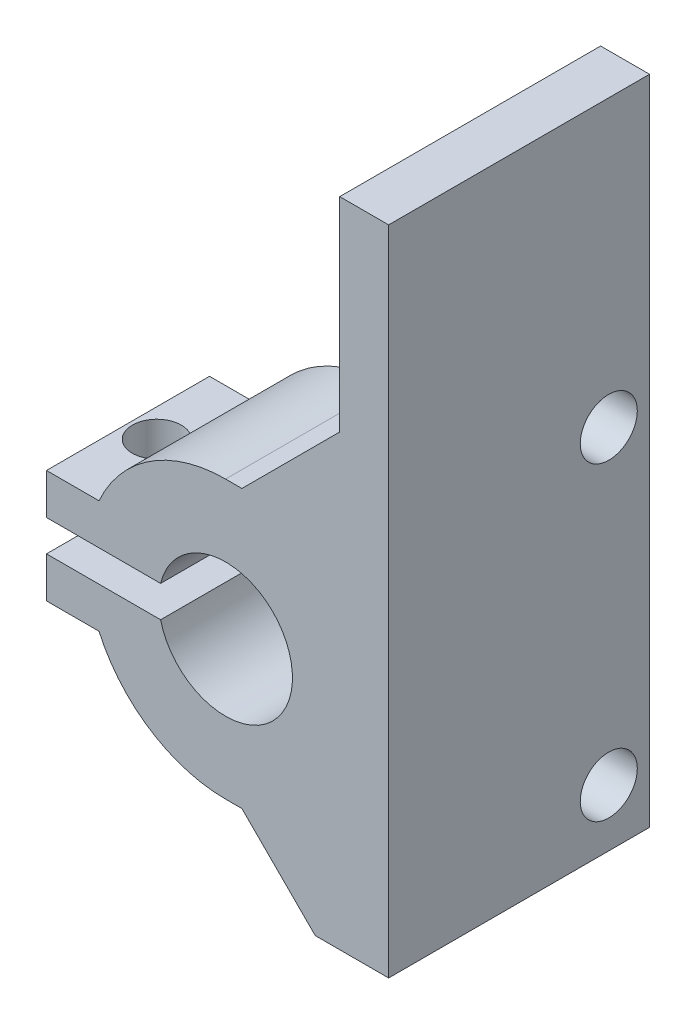
ISO-10303-21;
HEADER;
FILE_DESCRIPTION(('STEP AP214'),'2;1');
FILE_NAME('part.step','',(''),(''),'','','');
FILE_SCHEMA(('AUTOMOTIVE_DESIGN { 1 0 10303 214 1 1 1 1 }'));
ENDSEC;
DATA;
#1=APPLICATION_CONTEXT('core data for automotive mechanical design processes');
#2=APPLICATION_PROTOCOL_DEFINITION('international standard','automotive_design',2000,#1);
#3=PRODUCT_CONTEXT('',#1,'mechanical');
#4=PRODUCT('Part','Part','',(#3));
#5=PRODUCT_RELATED_PRODUCT_CATEGORY('part','',(#4));
#6=PRODUCT_DEFINITION_FORMATION('','',#4);
#7=PRODUCT_DEFINITION_CONTEXT('part definition',#1,'design');
#8=PRODUCT_DEFINITION('design','',#6,#7);
#9=PRODUCT_DEFINITION_SHAPE('','',#8);
#10=(LENGTH_UNIT() NAMED_UNIT(*) SI_UNIT(.MILLI.,.METRE.));
#11=(NAMED_UNIT(*) PLANE_ANGLE_UNIT() SI_UNIT($,.RADIAN.));
#12=(NAMED_UNIT(*) SI_UNIT($,.STERADIAN.) SOLID_ANGLE_UNIT());
#13=UNCERTAINTY_MEASURE_WITH_UNIT(LENGTH_MEASURE(1.E-05),#10,'distance_accuracy_value','');
#14=(GEOMETRIC_REPRESENTATION_CONTEXT(3) GLOBAL_UNCERTAINTY_ASSIGNED_CONTEXT((#13)) GLOBAL_UNIT_ASSIGNED_CONTEXT((#10,
#11,#12)) REPRESENTATION_CONTEXT('',''));
#15=CARTESIAN_POINT('',(0.,0.,0.));
#16=DIRECTION('',(0.,0.,1.));
#17=DIRECTION('',(1.,0.,0.));
#18=AXIS2_PLACEMENT_3D('',#15,#16,#17);
#19=CARTESIAN_POINT('',(0.,-8.5,10.));
#20=DIRECTION('',(0.,1.,0.));
#21=DIRECTION('',(0.,0.,1.));
#22=AXIS2_PLACEMENT_3D('',#19,#20,#21);
#23=PLANE('',#22);
#24=DIRECTION('',(1.,0.,0.));
#25=VECTOR('',#24,1.);
#26=CARTESIAN_POINT('',(0.,-8.5,0.));
#27=LINE('',#26,#25);
#28=CARTESIAN_POINT('',(0.,-8.5,0.));
#29=VERTEX_POINT('',#28);
#30=CARTESIAN_POINT('',(0.999999999999964,-8.5,0.));
#31=VERTEX_POINT('',#30);
#32=EDGE_CURVE('E448',#29,#31,#27,.T.);
#33=ORIENTED_EDGE('',*,*,#32,.T.);
#34=DIRECTION('',(0.,0.,1.));
#35=VECTOR('',#34,1.);
#36=CARTESIAN_POINT('',(0.999999999999964,-8.5,10.));
#37=LINE('',#36,#35);
#38=CARTESIAN_POINT('',(0.999999999999964,-8.5,10.));
#39=VERTEX_POINT('',#38);
#40=EDGE_CURVE('E439',#31,#39,#37,.T.);
#41=ORIENTED_EDGE('',*,*,#40,.T.);
#42=DIRECTION('',(1.,0.,0.));
#43=VECTOR('',#42,1.);
#44=CARTESIAN_POINT('',(0.,-8.5,10.));
#45=LINE('',#44,#43);
#46=CARTESIAN_POINT('',(0.,-8.5,10.));
#47=VERTEX_POINT('',#46);
#48=EDGE_CURVE('E735',#47,#39,#45,.T.);
#49=ORIENTED_EDGE('',*,*,#48,.F.);
#50=DIRECTION('',(0.,0.,-1.));
#51=VECTOR('',#50,1.);
#52=CARTESIAN_POINT('',(0.,-8.5,10.));
#53=LINE('',#52,#51);
#54=EDGE_CURVE('E454',#47,#29,#53,.T.);
#55=ORIENTED_EDGE('',*,*,#54,.T.);
#56=EDGE_LOOP('',(#33,#41,#49,#55));
#57=FACE_BOUND('',#56,.T.);
#58=ADVANCED_FACE('F34',(#57),#23,.F.);
#59=CARTESIAN_POINT('',(0.,8.5,10.));
#60=DIRECTION('',(0.,-1.,0.));
#61=DIRECTION('',(0.,0.,-1.));
#62=AXIS2_PLACEMENT_3D('',#59,#60,#61);
#63=PLANE('',#62);
#64=DIRECTION('',(-1.,0.,0.));
#65=VECTOR('',#64,1.);
#66=CARTESIAN_POINT('',(0.,8.5,10.));
#67=LINE('',#66,#65);
#68=CARTESIAN_POINT('',(0.999999999999912,8.5,10.));
#69=VERTEX_POINT('',#68);
#70=CARTESIAN_POINT('',(0.,8.5,10.));
#71=VERTEX_POINT('',#70);
#72=EDGE_CURVE('E733',#69,#71,#67,.T.);
#73=ORIENTED_EDGE('',*,*,#72,.F.);
#74=DIRECTION('',(0.,0.,-1.));
#75=VECTOR('',#74,1.);
#76=CARTESIAN_POINT('',(0.999999999999912,8.5,0.));
#77=LINE('',#76,#75);
#78=CARTESIAN_POINT('',(0.999999999999912,8.5,0.));
#79=VERTEX_POINT('',#78);
#80=EDGE_CURVE('E432',#69,#79,#77,.T.);
#81=ORIENTED_EDGE('',*,*,#80,.T.);
#82=DIRECTION('',(-1.,0.,0.));
#83=VECTOR('',#82,1.);
#84=CARTESIAN_POINT('',(0.,8.5,0.));
#85=LINE('',#84,#83);
#86=CARTESIAN_POINT('',(0.,8.5,0.));
#87=VERTEX_POINT('',#86);
#88=EDGE_CURVE('E455',#79,#87,#85,.T.);
#89=ORIENTED_EDGE('',*,*,#88,.T.);
#90=DIRECTION('',(0.,0.,-1.));
#91=VECTOR('',#90,1.);
#92=CARTESIAN_POINT('',(0.,8.5,10.));
#93=LINE('',#92,#91);
#94=EDGE_CURVE('E705',#71,#87,#93,.T.);
#95=ORIENTED_EDGE('',*,*,#94,.F.);
#96=EDGE_LOOP('',(#73,#81,#89,#95));
#97=FACE_BOUND('',#96,.T.);
#98=ADVANCED_FACE('F277',(#97),#63,.F.);
#99=CARTESIAN_POINT('',(0.,0.,0.));
#100=DIRECTION('',(0.,0.,1.));
#101=DIRECTION('',(1.,0.,0.));
#102=AXIS2_PLACEMENT_3D('',#99,#100,#101);
#103=PLANE('',#102);
#104=DIRECTION('',(0.,1.,0.));
#105=VECTOR('',#104,1.);
#106=CARTESIAN_POINT('',(6.,0.,0.));
#107=LINE('',#106,#105);
#108=CARTESIAN_POINT('',(6.,-12.,0.));
#109=VERTEX_POINT('',#108);
#110=CARTESIAN_POINT('',(6.,13.5,0.));
#111=VERTEX_POINT('',#110);
#112=EDGE_CURVE('E318',#109,#111,#107,.T.);
#113=ORIENTED_EDGE('',*,*,#112,.F.);
#114=DIRECTION('',(-0.707106781186548,0.707106781186548,0.));
#115=VECTOR('',#114,1.);
#116=CARTESIAN_POINT('',(-3.,-3.,0.));
#117=LINE('',#116,#115);
#118=CARTESIAN_POINT('',(7.00000000000001,-13.,0.));
#119=VERTEX_POINT('',#118);
#120=EDGE_CURVE('E11',#109,#119,#117,.F.);
#121=ORIENTED_EDGE('',*,*,#120,.T.);
#122=DIRECTION('',(1.,0.,0.));
#123=VECTOR('',#122,1.);
#124=CARTESIAN_POINT('',(10.,-13.,0.));
#125=LINE('',#124,#123);
#126=CARTESIAN_POINT('',(5.49999999999992,-13.,0.));
#127=VERTEX_POINT('',#126);
#128=EDGE_CURVE('E59',#119,#127,#125,.F.);
#129=ORIENTED_EDGE('',*,*,#128,.T.);
#130=DIRECTION('',(0.707106781186544,-0.707106781186551,0.));
#131=VECTOR('',#130,1.);
#132=CARTESIAN_POINT('',(-3.75000000000001,-3.74999999999997,0.));
#133=LINE('',#132,#131);
#134=EDGE_CURVE('E444',#127,#31,#133,.F.);
#135=ORIENTED_EDGE('',*,*,#134,.T.);
#136=ORIENTED_EDGE('',*,*,#32,.F.);
#137=CARTESIAN_POINT('',(0.,0.,0.));
#138=DIRECTION('',(0.,0.,1.));
#139=DIRECTION('',(1.,0.,0.));
#140=AXIS2_PLACEMENT_3D('',#137,#138,#139);
#141=CIRCLE('',#140,8.5);
#142=CARTESIAN_POINT('',(-7.76181764464928,-3.46470588235294,0.));
#143=VERTEX_POINT('',#142);
#144=EDGE_CURVE('E456',#143,#29,#141,.T.);
#145=ORIENTED_EDGE('',*,*,#144,.F.);
#146=DIRECTION('',(0.999999999999998,-6.08161782252128E-08,0.));
#147=VECTOR('',#146,1.);
#148=CARTESIAN_POINT('',(-7.76181764464928,-3.46470588235294,0.));
#149=LINE('',#148,#147);
#150=CARTESIAN_POINT('',(-10.984889325784,-3.46470568633804,0.));
#151=VERTEX_POINT('',#150);
#152=EDGE_CURVE('E672',#151,#143,#149,.T.);
#153=ORIENTED_EDGE('',*,*,#152,.F.);
#154=DIRECTION('',(0.,-1.,0.));
#155=VECTOR('',#154,1.);
#156=CARTESIAN_POINT('',(-10.984889325784,-0.964705686338039,0.));
#157=LINE('',#156,#155);
#158=CARTESIAN_POINT('',(-10.984889325784,-0.964705686338039,0.));
#159=VERTEX_POINT('',#158);
#160=EDGE_CURVE('E665',#159,#151,#157,.T.);
#161=ORIENTED_EDGE('',*,*,#160,.F.);
#162=DIRECTION('',(-1.,0.,0.));
#163=VECTOR('',#162,1.);
#164=CARTESIAN_POINT('',(-10.984889325784,-0.964705686338039,0.));
#165=LINE('',#164,#163);
#166=CARTESIAN_POINT('',(-3.98488932578397,-0.964705686338039,0.));
#167=VERTEX_POINT('',#166);
#168=EDGE_CURVE('E673',#167,#159,#165,.T.);
#169=ORIENTED_EDGE('',*,*,#168,.F.);
#170=CARTESIAN_POINT('',(0.,0.,0.));
#171=DIRECTION('',(0.,0.,-1.));
#172=DIRECTION('',(1.,0.,0.));
#173=AXIS2_PLACEMENT_3D('',#170,#171,#172);
#174=CIRCLE('',#173,4.1);
#175=CARTESIAN_POINT('',(-3.98488927833053,0.96470588235294,0.));
#176=VERTEX_POINT('',#175);
#177=EDGE_CURVE('E254',#176,#167,#174,.T.);
#178=ORIENTED_EDGE('',*,*,#177,.F.);
#179=DIRECTION('',(1.,0.,0.));
#180=VECTOR('',#179,1.);
#181=CARTESIAN_POINT('',(-3.98488927833053,0.96470588235294,0.));
#182=LINE('',#181,#180);
#183=CARTESIAN_POINT('',(-10.9848892783305,0.964705882352939,0.));
#184=VERTEX_POINT('',#183);
#185=EDGE_CURVE('E690',#184,#176,#182,.T.);
#186=ORIENTED_EDGE('',*,*,#185,.F.);
#187=DIRECTION('',(0.,-1.,0.));
#188=VECTOR('',#187,1.);
#189=CARTESIAN_POINT('',(-10.9848892783305,0.964705882352939,0.));
#190=LINE('',#189,#188);
#191=CARTESIAN_POINT('',(-10.9848892783305,3.46470588235294,0.));
#192=VERTEX_POINT('',#191);
#193=EDGE_CURVE('E688',#192,#184,#190,.T.);
#194=ORIENTED_EDGE('',*,*,#193,.F.);
#195=DIRECTION('',(-1.,0.,0.));
#196=VECTOR('',#195,1.);
#197=CARTESIAN_POINT('',(-10.9848892783305,3.46470588235294,0.));
#198=LINE('',#197,#196);
#199=CARTESIAN_POINT('',(-7.76181764464928,3.46470588235294,0.));
#200=VERTEX_POINT('',#199);
#201=EDGE_CURVE('E685',#200,#192,#198,.T.);
#202=ORIENTED_EDGE('',*,*,#201,.F.);
#203=CARTESIAN_POINT('',(0.,0.,0.));
#204=DIRECTION('',(0.,0.,1.));
#205=DIRECTION('',(1.,0.,0.));
#206=AXIS2_PLACEMENT_3D('',#203,#204,#205);
#207=CIRCLE('',#206,8.5);
#208=EDGE_CURVE('E682',#87,#200,#207,.T.);
#209=ORIENTED_EDGE('',*,*,#208,.F.);
#210=ORIENTED_EDGE('',*,*,#88,.F.);
#211=DIRECTION('',(-0.707106781186551,-0.707106781186544,0.));
#212=VECTOR('',#211,1.);
#213=CARTESIAN_POINT('',(-3.75000000000005,3.75000000000009,0.));
#214=LINE('',#213,#212);
#215=EDGE_CURVE('E437',#79,#111,#214,.F.);
#216=ORIENTED_EDGE('',*,*,#215,.T.);
#217=EDGE_LOOP('',(#113,#121,#129,#135,#136,#145,#153,#161,#169,#178,#186,#194,#202,#209,#210,#216));
#218=FACE_BOUND('',#217,.T.);
#219=ADVANCED_FACE('F273',(#218),#103,.F.);
#220=CARTESIAN_POINT('',(0.,0.,10.));
#221=DIRECTION('',(0.,0.,-1.));
#222=DIRECTION('',(-1.,0.,0.));
#223=AXIS2_PLACEMENT_3D('',#220,#221,#222);
#224=CYLINDRICAL_SURFACE('',#223,8.5);
#225=CARTESIAN_POINT('',(-7.76181764464928,-3.46470588235294,2.07242617561453));
#226=CARTESIAN_POINT('',(-7.70734472736729,-3.58681696636053,2.10081115035418));
#227=CARTESIAN_POINT('',(-7.65018241519739,-3.70705831735699,2.13247319057753));
#228=CARTESIAN_POINT('',(-7.53116662331992,-3.94321231160785,2.20379518649206));
#229=CARTESIAN_POINT('',(-7.46929984309949,-4.05911118617339,2.2434783869878));
#230=CARTESIAN_POINT('',(-7.34119272746333,-4.28650516625526,2.3326228547018));
#231=CARTESIAN_POINT('',(-7.27491177992635,-4.39793783217885,2.38218684616038));
#232=CARTESIAN_POINT('',(-7.14006586071867,-4.61363359849648,2.49218878601261));
#233=CARTESIAN_POINT('',(-7.071504046424,-4.71790604394668,2.5526121737255));
#234=CARTESIAN_POINT('',(-6.91665824478732,-4.94295333190967,2.70233681217529));
#235=CARTESIAN_POINT('',(-6.83021170452957,-5.06137364072598,2.79508238700871));
#236=CARTESIAN_POINT('',(-6.66154088136708,-5.28138288253585,3.00142428187995));
#237=CARTESIAN_POINT('',(-6.5793024296406,-5.38303126915351,3.11494380461664));
#238=CARTESIAN_POINT('',(-6.46310179875611,-5.52105462295688,3.30172903941076));
#239=CARTESIAN_POINT('',(-6.42533837513391,-5.56489214439046,3.36722508511447));
#240=CARTESIAN_POINT('',(-6.35328140252833,-5.64701565915378,3.50338331433131));
#241=CARTESIAN_POINT('',(-6.3189859775535,-5.68530465882771,3.57404266876227));
#242=CARTESIAN_POINT('',(-6.25471428850484,-5.75593922560085,3.72017104308801));
#243=CARTESIAN_POINT('',(-6.22473917375684,-5.78828321178442,3.79564133515645));
#244=CARTESIAN_POINT('',(-6.16994657451315,-5.84665405511785,3.95078124305059));
#245=CARTESIAN_POINT('',(-6.14512797744308,-5.87268227516636,4.03044994836312));
#246=CARTESIAN_POINT('',(-6.10466662305298,-5.9147073763916,4.18095462458582));
#247=CARTESIAN_POINT('',(-6.08820506011115,-5.93162441442413,4.2513155021302));
#248=CARTESIAN_POINT('',(-6.05988678166871,-5.9605521991224,4.39394220435443));
#249=CARTESIAN_POINT('',(-6.0480293784209,-5.97256367857076,4.46620774280172));
#250=CARTESIAN_POINT('',(-6.02919570336736,-5.99157583584486,4.61198443410922));
#251=CARTESIAN_POINT('',(-6.02221649345986,-5.99857952988329,4.68549480983648));
#252=CARTESIAN_POINT('',(-6.01328262996773,-6.00753394838576,4.833102108024));
#253=CARTESIAN_POINT('',(-6.01132758780307,-6.00948506362729,4.90719898467836));
#254=CARTESIAN_POINT('',(-6.01296842058666,-6.00785046198907,5.11255183870824));
#255=CARTESIAN_POINT('',(-6.0220105413055,-5.99883170337577,5.24380237215647));
#256=CARTESIAN_POINT('',(-6.05545546984858,-5.9650646002042,5.50213524949701));
#257=CARTESIAN_POINT('',(-6.07985460277206,-5.94032001878854,5.62921858293916));
#258=CARTESIAN_POINT('',(-6.14214679754113,-5.87588419173122,5.8754667151059));
#259=CARTESIAN_POINT('',(-6.17998571973372,-5.83625287813312,5.99466104042547));
#260=CARTESIAN_POINT('',(-6.26669625614904,-5.74304363856434,6.22312277742109));
#261=CARTESIAN_POINT('',(-6.31557054797636,-5.68946232730457,6.33238777082073));
#262=CARTESIAN_POINT('',(-6.42592563131725,-5.56461768120485,6.54808266326798));
#263=CARTESIAN_POINT('',(-6.4881213822584,-5.49224540546735,6.65349923047171));
#264=CARTESIAN_POINT('',(-6.61839299809601,-5.33453993555208,6.84995936307524));
#265=CARTESIAN_POINT('',(-6.68647091559546,-5.2492022090918,6.94099787960972));
#266=CARTESIAN_POINT('',(-6.80875890816746,-5.08905122024567,7.08909118167419));
#267=CARTESIAN_POINT('',(-6.86244542575364,-5.0165148102995,7.14909332997618));
#268=CARTESIAN_POINT('',(-6.97010771713046,-4.86581657176709,7.26134544417735));
#269=CARTESIAN_POINT('',(-7.02408361834585,-4.78765203744353,7.31359164392675));
#270=CARTESIAN_POINT('',(-7.13142000048256,-4.62625880711787,7.41100483790632));
#271=CARTESIAN_POINT('',(-7.18477829035631,-4.5430163197494,7.45615124257713));
#272=CARTESIAN_POINT('',(-7.28991379689209,-4.37232377386584,7.53986765244235));
#273=CARTESIAN_POINT('',(-7.34169055642498,-4.28487251730317,7.57843577072711));
#274=CARTESIAN_POINT('',(-7.45866614258649,-4.07876521041754,7.66069617217156));
#275=CARTESIAN_POINT('',(-7.52306974157909,-3.95881552079709,7.70229035785909));
#276=CARTESIAN_POINT('',(-7.61574359864451,-3.77559308356001,7.75810571622236));
#277=CARTESIAN_POINT('',(-7.64587509699423,-3.71420291559318,7.77556214195846));
#278=CARTESIAN_POINT('',(-7.70484076880066,-3.59028354188838,7.80854093952));
#279=CARTESIAN_POINT('',(-7.73367484414703,-3.52775425051117,7.8240631652389));
#280=CARTESIAN_POINT('',(-7.76181764464928,-3.46470588235294,7.83870747294992));
#281=B_SPLINE_CURVE_WITH_KNOTS('',3,(#225,#226,#227,#228,#229,#230,#231,#232,#233,#234,#235,
#236,#237,#238,#239,#240,#241,#242,#243,#244,#245,#246,#247,#248,#249,#250,#251,#252,#253,#254,
#255,#256,#257,#258,#259,#260,#261,#262,#263,#264,#265,#266,#267,#268,#269,#270,#271,#272,#273,
#274,#275,#276,#277,#278,#279,#280),.UNSPECIFIED.,.F.,.F.,(4,2,2,2,2,2,2,2,2,2,2,2,2,2,2,2,2,2,
2,2,2,2,2,2,2,2,2,4),(0.,0.410115252381126,0.821436485477286,1.23728073592192,1.65257151133061,
2.17125368228346,2.68805576014037,2.94990154283991,3.21160491540202,3.4733777805347,
3.73509410655712,3.95742378767881,4.17972024547532,4.4018827000276,4.62402797153626,
5.01755956905764,5.41099703107919,5.80286725178367,6.19483265762989,6.61980094949073,
7.0449181391339,7.36959836994546,7.69443574755307,8.02019844729648,8.34605443194326,
8.77258148688587,8.98428097866804,9.19599645222683),.UNSPECIFIED.);
#282=CARTESIAN_POINT('',(-7.76181764464928,-3.46470588235294,2.07242617561452));
#283=VERTEX_POINT('',#282);
#284=CARTESIAN_POINT('',(-7.76181764464928,-3.46470588235294,7.83870747294992));
#285=VERTEX_POINT('',#284);
#286=EDGE_CURVE('E311',#283,#285,#281,.T.);
#287=ORIENTED_EDGE('',*,*,#286,.F.);
#288=DIRECTION('',(0.,0.,-1.));
#289=VECTOR('',#288,1.);
#290=CARTESIAN_POINT('',(-7.76181764464928,-3.46470588235294,10.));
#291=LINE('',#290,#289);
#292=EDGE_CURVE('E709',#283,#143,#291,.T.);
#293=ORIENTED_EDGE('',*,*,#292,.T.);
#294=ORIENTED_EDGE('',*,*,#144,.T.);
#295=ORIENTED_EDGE('',*,*,#54,.F.);
#296=CARTESIAN_POINT('',(0.,0.,10.));
#297=DIRECTION('',(0.,0.,1.));
#298=DIRECTION('',(1.,0.,0.));
#299=AXIS2_PLACEMENT_3D('',#296,#297,#298);
#300=CIRCLE('',#299,8.5);
#301=CARTESIAN_POINT('',(-7.76181764464928,-3.46470588235294,10.));
#302=VERTEX_POINT('',#301);
#303=EDGE_CURVE('E737',#302,#47,#300,.T.);
#304=ORIENTED_EDGE('',*,*,#303,.F.);
#305=EDGE_CURVE('E710',#302,#285,#291,.T.);
#306=ORIENTED_EDGE('',*,*,#305,.T.);
#307=EDGE_LOOP('',(#287,#293,#294,#295,#304,#306));
#308=FACE_BOUND('',#307,.T.);
#309=ADVANCED_FACE('F276',(#308),#224,.T.);
#310=CARTESIAN_POINT('',(0.,0.,10.));
#311=DIRECTION('',(0.,0.,-1.));
#312=DIRECTION('',(-1.,0.,0.));
#313=AXIS2_PLACEMENT_3D('',#310,#311,#312);
#314=CYLINDRICAL_SURFACE('',#313,8.5);
#315=CARTESIAN_POINT('',(-7.76181764464928,3.46470588235294,7.83870747294992));
#316=CARTESIAN_POINT('',(-7.70734472716962,3.58681696678743,7.81032250196887));
#317=CARTESIAN_POINT('',(-7.65018241472601,3.70705831835817,7.77866046593117));
#318=CARTESIAN_POINT('',(-7.53116662200858,3.94321231414438,7.70733847934255));
#319=CARTESIAN_POINT('',(-7.4692998412233,4.05911118967474,7.66765528399389));
#320=CARTESIAN_POINT('',(-7.34119272393771,4.28650517234019,7.57851082763034));
#321=CARTESIAN_POINT('',(-7.2749117753096,4.39793783988758,7.52894684238349));
#322=CARTESIAN_POINT('',(-7.14006585314807,4.61363361028272,7.41894491592641));
#323=CARTESIAN_POINT('',(-7.07150403699106,4.71790605818371,7.35852153539273));
#324=CARTESIAN_POINT('',(-6.9166582269581,4.94295335716525,7.20879691110167));
#325=CARTESIAN_POINT('',(-6.83021167983953,5.06137367436531,7.11605134280611));
#326=CARTESIAN_POINT('',(-6.6615408411988,5.28138293350188,6.90970945998014));
#327=CARTESIAN_POINT('',(-6.57930238086281,5.38303132905389,6.79618994274583));
#328=CARTESIAN_POINT('',(-6.46310173599079,5.52105469650583,6.60940471453257));
#329=CARTESIAN_POINT('',(-6.42533830746112,5.56489222259375,6.5439086706838));
#330=CARTESIAN_POINT('',(-6.35328132486147,5.64701574659938,6.4077504444888));
#331=CARTESIAN_POINT('',(-6.31898589479999,5.68530475086158,6.33709109122536));
#332=CARTESIAN_POINT('',(-6.2547141955722,5.75593932664259,6.19096271847577));
#333=CARTESIAN_POINT('',(-6.22473907572978,5.78828331724839,6.11549242681791));
#334=CARTESIAN_POINT('',(-6.16994646647321,5.84665416917681,5.9603525189056));
#335=CARTESIAN_POINT('',(-6.14512786448435,5.87268239339849,5.88068381316477));
#336=CARTESIAN_POINT('',(-6.10466650177077,5.91470750159001,5.7301791369332));
#337=CARTESIAN_POINT('',(-6.0882049352753,5.93162454257068,5.65981825997892));
#338=CARTESIAN_POINT('',(-6.05988664991517,5.96055233308694,5.51719155844966));
#339=CARTESIAN_POINT('',(-6.04802924330305,5.97256381540539,5.4449260201074));
#340=CARTESIAN_POINT('',(-6.02919556180953,5.99157597830105,5.29914932855418));
#341=CARTESIAN_POINT('',(-6.02221634882589,5.99857967509132,5.22563895247654));
#342=CARTESIAN_POINT('',(-6.01328247955296,6.00753409894861,5.07803165318371));
#343=CARTESIAN_POINT('',(-6.01132743468341,6.00948521679333,5.0039347757745));
#344=CARTESIAN_POINT('',(-6.01296826053649,6.00785062217398,4.79858192404345));
#345=CARTESIAN_POINT('',(-6.02201037690383,5.99883186838657,4.66733139328176));
#346=CARTESIAN_POINT('',(-6.05545529724003,5.96506477540276,4.40899852027233));
#347=CARTESIAN_POINT('',(-6.07985442630622,5.94032019935066,4.28191518847454));
#348=CARTESIAN_POINT('',(-6.14214661365126,5.87588438390032,4.03566706037103));
#349=CARTESIAN_POINT('',(-6.17998553208615,5.83625307675208,3.91647273737142));
#350=CARTESIAN_POINT('',(-6.2666960615612,5.74304385081338,3.68801100390816));
#351=CARTESIAN_POINT('',(-6.31557035020664,5.68946254673333,3.57874601172113));
#352=CARTESIAN_POINT('',(-6.42592542752267,5.56461791641333,3.36305112112621));
#353=CARTESIAN_POINT('',(-6.48812117565637,5.49224564937529,3.25763455442991));
#354=CARTESIAN_POINT('',(-6.61839278688418,5.33454019743445,3.06117442177881));
#355=CARTESIAN_POINT('',(-6.68647070257968,5.24920248025364,2.97013590468416));
#356=CARTESIAN_POINT('',(-6.80875869274658,5.08905150834747,2.82204260111121));
#357=CARTESIAN_POINT('',(-6.86244520949138,5.01651510601874,2.76204045201187));
#358=CARTESIAN_POINT('',(-6.97010749985489,4.86581688288185,2.64978833574042));
#359=CARTESIAN_POINT('',(-7.02408340089867,4.78765235633666,2.59754213471757));
#360=CARTESIAN_POINT('',(-7.13141978345739,4.62625914153184,2.50012893773566));
#361=CARTESIAN_POINT('',(-7.18477807392549,4.54301666189837,2.45498253134633));
#362=CARTESIAN_POINT('',(-7.28991358232089,4.37232413147944,2.37126611778641));
#363=CARTESIAN_POINT('',(-7.34169034311902,4.28487288264578,2.33269799752634));
#364=CARTESIAN_POINT('',(-7.45866597081984,4.07876552678275,2.25043756467861));
#365=CARTESIAN_POINT('',(-7.52306960813854,3.95881577687387,2.20884335525103));
#366=CARTESIAN_POINT('',(-7.61574351857622,3.77559324571347,2.15302796805097));
#367=CARTESIAN_POINT('',(-7.64587503392524,3.71420304609196,2.13557153387555));
#368=CARTESIAN_POINT('',(-7.70484073833685,3.59028360795308,2.10259272133012));
#369=CARTESIAN_POINT('',(-7.73367482928953,3.52775428379688,2.08707048906595));
#370=CARTESIAN_POINT('',(-7.76181764464928,3.46470588235294,2.07242617561452));
#371=B_SPLINE_CURVE_WITH_KNOTS('',3,(#315,#316,#317,#318,#319,#320,#321,#322,#323,#324,#325,
#326,#327,#328,#329,#330,#331,#332,#333,#334,#335,#336,#337,#338,#339,#340,#341,#342,#343,#344,
#345,#346,#347,#348,#349,#350,#351,#352,#353,#354,#355,#356,#357,#358,#359,#360,#361,#362,#363,
#364,#365,#366,#367,#368,#369,#370),.UNSPECIFIED.,.F.,.F.,(4,2,2,2,2,2,2,2,2,2,2,2,2,2,2,2,2,2,
2,2,2,2,2,2,2,2,2,4),(0.,0.410115251401963,0.821436483303212,1.23728073266067,1.65257150709289,
2.17125369505933,2.68805579007703,2.94990158195271,3.21160496367354,3.47337783784949,
3.73509417289745,3.95742385670063,4.17972031716818,4.40188277437731,4.62402804853383,
5.01755963615662,5.41099708823609,5.8028672935807,6.19483268408238,6.61980095791385,
7.04491812938011,7.36959834499115,7.69443570737947,8.0201983923741,8.34605436231494,
8.77258164154295,8.98428124390928,9.19599682797043),.UNSPECIFIED.);
#372=CARTESIAN_POINT('',(-7.76181764464928,3.46470588235294,7.83870747294992));
#373=VERTEX_POINT('',#372);
#374=CARTESIAN_POINT('',(-7.76181764464928,3.46470588235294,2.07242617561452));
#375=VERTEX_POINT('',#374);
#376=EDGE_CURVE('E245',#373,#375,#371,.T.);
#377=ORIENTED_EDGE('',*,*,#376,.F.);
#378=DIRECTION('',(0.,0.,-1.));
#379=VECTOR('',#378,1.);
#380=CARTESIAN_POINT('',(-7.76181764464928,3.46470588235294,10.));
#381=LINE('',#380,#379);
#382=CARTESIAN_POINT('',(-7.76181764464928,3.46470588235294,10.));
#383=VERTEX_POINT('',#382);
#384=EDGE_CURVE('E702',#383,#373,#381,.T.);
#385=ORIENTED_EDGE('',*,*,#384,.F.);
#386=CARTESIAN_POINT('',(0.,0.,10.));
#387=DIRECTION('',(0.,0.,1.));
#388=DIRECTION('',(1.,0.,0.));
#389=AXIS2_PLACEMENT_3D('',#386,#387,#388);
#390=CIRCLE('',#389,8.5);
#391=EDGE_CURVE('E731',#71,#383,#390,.T.);
#392=ORIENTED_EDGE('',*,*,#391,.F.);
#393=ORIENTED_EDGE('',*,*,#94,.T.);
#394=ORIENTED_EDGE('',*,*,#208,.T.);
#395=EDGE_CURVE('E701',#375,#200,#381,.T.);
#396=ORIENTED_EDGE('',*,*,#395,.F.);
#397=EDGE_LOOP('',(#377,#385,#392,#393,#394,#396));
#398=FACE_BOUND('',#397,.T.);
#399=ADVANCED_FACE('F257',(#398),#314,.T.);
#400=CARTESIAN_POINT('',(0.,0.,10.));
#401=DIRECTION('',(0.,0.,-1.));
#402=DIRECTION('',(-1.,0.,0.));
#403=AXIS2_PLACEMENT_3D('',#400,#401,#402);
#404=CYLINDRICAL_SURFACE('',#403,4.1);
#405=ORIENTED_EDGE('',*,*,#177,.T.);
#406=DIRECTION('',(0.,0.,-1.));
#407=VECTOR('',#406,1.);
#408=CARTESIAN_POINT('',(-3.98488932578397,-0.964705686338039,10.));
#409=LINE('',#408,#407);
#410=CARTESIAN_POINT('',(-3.98488932578397,-0.964705686338039,10.));
#411=VERTEX_POINT('',#410);
#412=EDGE_CURVE('E319',#411,#167,#409,.T.);
#413=ORIENTED_EDGE('',*,*,#412,.F.);
#414=CARTESIAN_POINT('',(0.,0.,10.));
#415=DIRECTION('',(0.,0.,-1.));
#416=DIRECTION('',(1.,0.,0.));
#417=AXIS2_PLACEMENT_3D('',#414,#415,#416);
#418=CIRCLE('',#417,4.1);
#419=CARTESIAN_POINT('',(-3.98488927833053,0.96470588235294,10.));
#420=VERTEX_POINT('',#419);
#421=EDGE_CURVE('E255',#420,#411,#418,.T.);
#422=ORIENTED_EDGE('',*,*,#421,.F.);
#423=DIRECTION('',(0.,0.,-1.));
#424=VECTOR('',#423,1.);
#425=CARTESIAN_POINT('',(-3.98488927833053,0.96470588235294,10.));
#426=LINE('',#425,#424);
#427=EDGE_CURVE('E692',#420,#176,#426,.T.);
#428=ORIENTED_EDGE('',*,*,#427,.T.);
#429=EDGE_LOOP('',(#405,#413,#422,#428));
#430=FACE_BOUND('',#429,.T.);
#431=ADVANCED_FACE('F614',(#430),#404,.F.);
#432=CARTESIAN_POINT('',(-10.984889325784,-0.964705686338039,10.));
#433=DIRECTION('',(0.,-1.,0.));
#434=DIRECTION('',(0.,0.,-1.));
#435=AXIS2_PLACEMENT_3D('',#432,#433,#434);
#436=PLANE('',#435);
#437=CARTESIAN_POINT('',(-9.26181764464928,-0.964705686338039,4.95556682428222));
#438=DIRECTION('',(0.,-1.,0.));
#439=DIRECTION('',(0.,0.,-1.));
#440=AXIS2_PLACEMENT_3D('',#437,#438,#439);
#441=CIRCLE('',#440,1.5);
#442=CARTESIAN_POINT('',(-9.26181764464928,-0.964705686338039,3.45556682428222));
#443=VERTEX_POINT('',#442);
#444=EDGE_CURVE('E240',#443,#443,#441,.T.);
#445=ORIENTED_EDGE('',*,*,#444,.T.);
#446=EDGE_LOOP('',(#445));
#447=FACE_BOUND('',#446,.T.);
#448=ORIENTED_EDGE('',*,*,#168,.T.);
#449=DIRECTION('',(0.,0.,-1.));
#450=VECTOR('',#449,1.);
#451=CARTESIAN_POINT('',(-10.984889325784,-0.964705686338039,10.));
#452=LINE('',#451,#450);
#453=CARTESIAN_POINT('',(-10.984889325784,-0.964705686338039,10.));
#454=VERTEX_POINT('',#453);
#455=EDGE_CURVE('E671',#454,#159,#452,.T.);
#456=ORIENTED_EDGE('',*,*,#455,.F.);
#457=DIRECTION('',(-1.,0.,0.));
#458=VECTOR('',#457,1.);
#459=CARTESIAN_POINT('',(-10.984889325784,-0.964705686338039,10.));
#460=LINE('',#459,#458);
#461=EDGE_CURVE('E718',#411,#454,#460,.T.);
#462=ORIENTED_EDGE('',*,*,#461,.F.);
#463=ORIENTED_EDGE('',*,*,#412,.T.);
#464=EDGE_LOOP('',(#448,#456,#462,#463));
#465=FACE_BOUND('',#464,.T.);
#466=ADVANCED_FACE('F641',(#447,#465),#436,.F.);
#467=CARTESIAN_POINT('',(-10.984889325784,-0.964705686338039,10.));
#468=DIRECTION('',(1.,0.,0.));
#469=DIRECTION('',(0.,1.,0.));
#470=AXIS2_PLACEMENT_3D('',#467,#468,#469);
#471=PLANE('',#470);
#472=ORIENTED_EDGE('',*,*,#160,.T.);
#473=DIRECTION('',(0.,0.,-1.));
#474=VECTOR('',#473,1.);
#475=CARTESIAN_POINT('',(-10.984889325784,-3.46470568633804,10.));
#476=LINE('',#475,#474);
#477=CARTESIAN_POINT('',(-10.984889325784,-3.46470568633804,10.));
#478=VERTEX_POINT('',#477);
#479=EDGE_CURVE('E668',#478,#151,#476,.T.);
#480=ORIENTED_EDGE('',*,*,#479,.F.);
#481=DIRECTION('',(0.,-1.,0.));
#482=VECTOR('',#481,1.);
#483=CARTESIAN_POINT('',(-10.984889325784,-0.964705686338039,10.));
#484=LINE('',#483,#482);
#485=EDGE_CURVE('E741',#454,#478,#484,.T.);
#486=ORIENTED_EDGE('',*,*,#485,.F.);
#487=ORIENTED_EDGE('',*,*,#455,.T.);
#488=EDGE_LOOP('',(#472,#480,#486,#487));
#489=FACE_BOUND('',#488,.T.);
#490=ADVANCED_FACE('F292',(#489),#471,.F.);
#491=CARTESIAN_POINT('',(-7.76181764464928,-3.46470588235294,10.));
#492=DIRECTION('',(6.08161782252128E-08,0.999999999999998,0.));
#493=DIRECTION('',(-0.999999999999998,6.08161782252128E-08,0.));
#494=AXIS2_PLACEMENT_3D('',#491,#492,#493);
#495=PLANE('',#494);
#496=ORIENTED_EDGE('',*,*,#479,.T.);
#497=ORIENTED_EDGE('',*,*,#152,.T.);
#498=ORIENTED_EDGE('',*,*,#292,.F.);
#499=CARTESIAN_POINT('',(-9.26181764464928,-3.46470579112868,4.95556682428222));
#500=DIRECTION('',(-6.08161782252128E-08,-0.999999999999998,0.));
#501=DIRECTION('',(0.999999999999998,-6.08161782252128E-08,0.));
#502=AXIS2_PLACEMENT_3D('',#499,#500,#501);
#503=CIRCLE('',#502,3.25);
#504=EDGE_CURVE('E225',#283,#285,#503,.T.);
#505=ORIENTED_EDGE('',*,*,#504,.T.);
#506=ORIENTED_EDGE('',*,*,#305,.F.);
#507=DIRECTION('',(0.999999999999998,-6.08161782252128E-08,0.));
#508=VECTOR('',#507,1.);
#509=CARTESIAN_POINT('',(-7.76181764464928,-3.46470588235294,10.));
#510=LINE('',#509,#508);
#511=EDGE_CURVE('E739',#478,#302,#510,.T.);
#512=ORIENTED_EDGE('',*,*,#511,.F.);
#513=EDGE_LOOP('',(#496,#497,#498,#505,#506,#512));
#514=FACE_BOUND('',#513,.T.);
#515=CARTESIAN_POINT('',(-9.26181764464928,-3.46470579112867,4.95556682428222));
#516=DIRECTION('',(6.08161782252128E-08,0.999999999999998,0.));
#517=DIRECTION('',(-0.999999999999998,6.08161782252128E-08,0.));
#518=AXIS2_PLACEMENT_3D('',#515,#516,#517);
#519=CIRCLE('',#518,1.5);
#520=CARTESIAN_POINT('',(-10.7618176446493,-3.46470569990441,4.95556682428222));
#521=VERTEX_POINT('',#520);
#522=EDGE_CURVE('E237',#521,#521,#519,.T.);
#523=ORIENTED_EDGE('',*,*,#522,.T.);
#524=EDGE_LOOP('',(#523));
#525=FACE_BOUND('',#524,.T.);
#526=ADVANCED_FACE('F287',(#514,#525),#495,.F.);
#527=CARTESIAN_POINT('',(-10.9848892783305,3.46470588235294,10.));
#528=DIRECTION('',(0.,-1.,0.));
#529=DIRECTION('',(1.,0.,0.));
#530=AXIS2_PLACEMENT_3D('',#527,#528,#529);
#531=PLANE('',#530);
#532=CARTESIAN_POINT('',(-9.26181764464928,3.46470588235294,4.95556682428222));
#533=DIRECTION('',(0.,1.,0.));
#534=DIRECTION('',(-1.,0.,0.));
#535=AXIS2_PLACEMENT_3D('',#532,#533,#534);
#536=CIRCLE('',#535,1.5);
#537=CARTESIAN_POINT('',(-10.7618176446493,3.46470588235294,4.95556682428222));
#538=VERTEX_POINT('',#537);
#539=EDGE_CURVE('E228',#538,#538,#536,.T.);
#540=ORIENTED_EDGE('',*,*,#539,.F.);
#541=EDGE_LOOP('',(#540));
#542=FACE_BOUND('',#541,.T.);
#543=ORIENTED_EDGE('',*,*,#384,.T.);
#544=CARTESIAN_POINT('',(-9.26181764464928,3.46470588235294,4.95556682428222));
#545=DIRECTION('',(0.,1.,0.));
#546=DIRECTION('',(-1.,0.,0.));
#547=AXIS2_PLACEMENT_3D('',#544,#545,#546);
#548=CIRCLE('',#547,3.25);
#549=EDGE_CURVE('E243',#373,#375,#548,.T.);
#550=ORIENTED_EDGE('',*,*,#549,.T.);
#551=ORIENTED_EDGE('',*,*,#395,.T.);
#552=ORIENTED_EDGE('',*,*,#201,.T.);
#553=DIRECTION('',(0.,0.,-1.));
#554=VECTOR('',#553,1.);
#555=CARTESIAN_POINT('',(-10.9848892783305,3.46470588235294,10.));
#556=LINE('',#555,#554);
#557=CARTESIAN_POINT('',(-10.9848892783305,3.46470588235294,10.));
#558=VERTEX_POINT('',#557);
#559=EDGE_CURVE('E699',#558,#192,#556,.T.);
#560=ORIENTED_EDGE('',*,*,#559,.F.);
#561=DIRECTION('',(-1.,0.,0.));
#562=VECTOR('',#561,1.);
#563=CARTESIAN_POINT('',(-10.9848892783305,3.46470588235294,10.));
#564=LINE('',#563,#562);
#565=EDGE_CURVE('E729',#383,#558,#564,.T.);
#566=ORIENTED_EDGE('',*,*,#565,.F.);
#567=EDGE_LOOP('',(#543,#550,#551,#552,#560,#566));
#568=FACE_BOUND('',#567,.T.);
#569=ADVANCED_FACE('F284',(#542,#568),#531,.F.);
#570=CARTESIAN_POINT('',(-10.9848892783305,0.964705882352939,10.));
#571=DIRECTION('',(1.,0.,0.));
#572=DIRECTION('',(0.,1.,0.));
#573=AXIS2_PLACEMENT_3D('',#570,#571,#572);
#574=PLANE('',#573);
#575=ORIENTED_EDGE('',*,*,#193,.T.);
#576=DIRECTION('',(0.,0.,-1.));
#577=VECTOR('',#576,1.);
#578=CARTESIAN_POINT('',(-10.9848892783305,0.964705882352939,10.));
#579=LINE('',#578,#577);
#580=CARTESIAN_POINT('',(-10.9848892783305,0.964705882352939,10.));
#581=VERTEX_POINT('',#580);
#582=EDGE_CURVE('E695',#581,#184,#579,.T.);
#583=ORIENTED_EDGE('',*,*,#582,.F.);
#584=DIRECTION('',(0.,-1.,0.));
#585=VECTOR('',#584,1.);
#586=CARTESIAN_POINT('',(-10.9848892783305,0.964705882352939,10.));
#587=LINE('',#586,#585);
#588=EDGE_CURVE('E727',#558,#581,#587,.T.);
#589=ORIENTED_EDGE('',*,*,#588,.F.);
#590=ORIENTED_EDGE('',*,*,#559,.T.);
#591=EDGE_LOOP('',(#575,#583,#589,#590));
#592=FACE_BOUND('',#591,.T.);
#593=ADVANCED_FACE('F281',(#592),#574,.F.);
#594=CARTESIAN_POINT('',(-3.98488927833053,0.96470588235294,10.));
#595=DIRECTION('',(0.,1.,0.));
#596=DIRECTION('',(-1.,0.,0.));
#597=AXIS2_PLACEMENT_3D('',#594,#595,#596);
#598=PLANE('',#597);
#599=CARTESIAN_POINT('',(-9.26181764464928,0.96470588235294,4.95556682428222));
#600=DIRECTION('',(0.,1.,0.));
#601=DIRECTION('',(-1.,0.,0.));
#602=AXIS2_PLACEMENT_3D('',#599,#600,#601);
#603=CIRCLE('',#602,1.5);
#604=CARTESIAN_POINT('',(-10.7618176446493,0.964705882352939,4.95556682428222));
#605=VERTEX_POINT('',#604);
#606=EDGE_CURVE('E236',#605,#605,#603,.T.);
#607=ORIENTED_EDGE('',*,*,#606,.T.);
#608=EDGE_LOOP('',(#607));
#609=FACE_BOUND('',#608,.T.);
#610=ORIENTED_EDGE('',*,*,#185,.T.);
#611=ORIENTED_EDGE('',*,*,#427,.F.);
#612=DIRECTION('',(1.,0.,0.));
#613=VECTOR('',#612,1.);
#614=CARTESIAN_POINT('',(-3.98488927833053,0.96470588235294,10.));
#615=LINE('',#614,#613);
#616=EDGE_CURVE('E696',#581,#420,#615,.T.);
#617=ORIENTED_EDGE('',*,*,#616,.F.);
#618=ORIENTED_EDGE('',*,*,#582,.T.);
#619=EDGE_LOOP('',(#610,#611,#617,#618));
#620=FACE_BOUND('',#619,.T.);
#621=ADVANCED_FACE('F272',(#609,#620),#598,.F.);
#622=CARTESIAN_POINT('',(0.,0.,10.));
#623=DIRECTION('',(0.,0.,1.));
#624=DIRECTION('',(1.,0.,0.));
#625=AXIS2_PLACEMENT_3D('',#622,#623,#624);
#626=PLANE('',#625);
#627=DIRECTION('',(-1.,0.,0.));
#628=VECTOR('',#627,1.);
#629=CARTESIAN_POINT('',(10.,27.,10.));
#630=LINE('',#629,#628);
#631=CARTESIAN_POINT('',(10.,27.,10.));
#632=VERTEX_POINT('',#631);
#633=CARTESIAN_POINT('',(7.00000000000001,27.,10.));
#634=VERTEX_POINT('',#633);
#635=EDGE_CURVE('E406',#632,#634,#630,.T.);
#636=ORIENTED_EDGE('',*,*,#635,.T.);
#637=DIRECTION('',(0.,-1.,0.));
#638=VECTOR('',#637,1.);
#639=CARTESIAN_POINT('',(7.00000000000001,13.5,10.));
#640=LINE('',#639,#638);
#641=CARTESIAN_POINT('',(7.00000000000001,14.5,10.));
#642=VERTEX_POINT('',#641);
#643=EDGE_CURVE('E419',#634,#642,#640,.T.);
#644=ORIENTED_EDGE('',*,*,#643,.T.);
#645=DIRECTION('',(0.707106781186551,0.707106781186544,0.));
#646=VECTOR('',#645,1.);
#647=CARTESIAN_POINT('',(6.,13.5,10.));
#648=LINE('',#647,#646);
#649=EDGE_CURVE('E433',#642,#69,#648,.F.);
#650=ORIENTED_EDGE('',*,*,#649,.T.);
#651=ORIENTED_EDGE('',*,*,#72,.T.);
#652=ORIENTED_EDGE('',*,*,#391,.T.);
#653=ORIENTED_EDGE('',*,*,#565,.T.);
#654=ORIENTED_EDGE('',*,*,#588,.T.);
#655=ORIENTED_EDGE('',*,*,#616,.T.);
#656=ORIENTED_EDGE('',*,*,#421,.T.);
#657=ORIENTED_EDGE('',*,*,#461,.T.);
#658=ORIENTED_EDGE('',*,*,#485,.T.);
#659=ORIENTED_EDGE('',*,*,#511,.T.);
#660=ORIENTED_EDGE('',*,*,#303,.T.);
#661=ORIENTED_EDGE('',*,*,#48,.T.);
#662=DIRECTION('',(-0.707106781186544,0.707106781186551,0.));
#663=VECTOR('',#662,1.);
#664=CARTESIAN_POINT('',(6.,-13.5000000000001,10.));
#665=LINE('',#664,#663);
#666=CARTESIAN_POINT('',(5.49999999999992,-13.,10.));
#667=VERTEX_POINT('',#666);
#668=EDGE_CURVE('E223',#39,#667,#665,.F.);
#669=ORIENTED_EDGE('',*,*,#668,.T.);
#670=DIRECTION('',(-1.,0.,0.));
#671=VECTOR('',#670,1.);
#672=CARTESIAN_POINT('',(10.,-13.,10.));
#673=LINE('',#672,#671);
#674=CARTESIAN_POINT('',(10.,-13.,10.));
#675=VERTEX_POINT('',#674);
#676=EDGE_CURVE('E203',#675,#667,#673,.T.);
#677=ORIENTED_EDGE('',*,*,#676,.F.);
#678=DIRECTION('',(0.,-1.,0.));
#679=VECTOR('',#678,1.);
#680=CARTESIAN_POINT('',(10.,27.,10.));
#681=LINE('',#680,#679);
#682=EDGE_CURVE('E209',#632,#675,#681,.T.);
#683=ORIENTED_EDGE('',*,*,#682,.F.);
#684=EDGE_LOOP('',(#636,#644,#650,#651,#652,#653,#654,#655,#656,#657,#658,#659,#660,#661,#669,
#677,#683));
#685=FACE_BOUND('',#684,.T.);
#686=ADVANCED_FACE('F221',(#685),#626,.T.);
#687=CARTESIAN_POINT('',(-9.26181764464928,13.4647058823529,4.95556682428222));
#688=DIRECTION('',(0.,-1.,0.));
#689=DIRECTION('',(1.,0.,0.));
#690=AXIS2_PLACEMENT_3D('',#687,#688,#689);
#691=CYLINDRICAL_SURFACE('',#690,3.25);
#692=ORIENTED_EDGE('',*,*,#376,.T.);
#693=ORIENTED_EDGE('',*,*,#549,.F.);
#694=EDGE_LOOP('',(#692,#693));
#695=FACE_BOUND('',#694,.T.);
#696=ADVANCED_FACE('F261',(#695),#691,.F.);
#697=CARTESIAN_POINT('',(-9.26181764464928,-6.53529411764706,4.95556682428222));
#698=DIRECTION('',(0.,1.,0.));
#699=DIRECTION('',(-1.,0.,0.));
#700=AXIS2_PLACEMENT_3D('',#697,#698,#699);
#701=CYLINDRICAL_SURFACE('',#700,1.5);
#702=ORIENTED_EDGE('',*,*,#539,.T.);
#703=EDGE_LOOP('',(#702));
#704=FACE_BOUND('',#703,.T.);
#705=ORIENTED_EDGE('',*,*,#606,.F.);
#706=EDGE_LOOP('',(#705));
#707=FACE_BOUND('',#706,.T.);
#708=ADVANCED_FACE('F266',(#704,#707),#701,.F.);
#709=ORIENTED_EDGE('',*,*,#522,.F.);
#710=EDGE_LOOP('',(#709));
#711=FACE_BOUND('',#710,.T.);
#712=ORIENTED_EDGE('',*,*,#444,.F.);
#713=EDGE_LOOP('',(#712));
#714=FACE_BOUND('',#713,.T.);
#715=ADVANCED_FACE('F268',(#711,#714),#701,.F.);
#716=CARTESIAN_POINT('',(-9.26181825281107,-13.4647057911287,4.95556682428222));
#717=DIRECTION('',(6.08161782252128E-08,0.999999999999998,0.));
#718=DIRECTION('',(-0.999999999999998,6.08161782252128E-08,0.));
#719=AXIS2_PLACEMENT_3D('',#716,#717,#718);
#720=CYLINDRICAL_SURFACE('',#719,3.25);
#721=ORIENTED_EDGE('',*,*,#286,.T.);
#722=ORIENTED_EDGE('',*,*,#504,.F.);
#723=EDGE_LOOP('',(#721,#722));
#724=FACE_BOUND('',#723,.T.);
#725=ADVANCED_FACE('F322',(#724),#720,.F.);
#726=CARTESIAN_POINT('',(6.,0.,0.));
#727=DIRECTION('',(1.,0.,0.));
#728=DIRECTION('',(0.,0.,-1.));
#729=AXIS2_PLACEMENT_3D('',#726,#727,#728);
#730=PLANE('',#729);
#731=CARTESIAN_POINT('',(6.,9.5,-3.5));
#732=DIRECTION('',(1.,0.,0.));
#733=DIRECTION('',(0.,0.,-1.));
#734=AXIS2_PLACEMENT_3D('',#731,#732,#733);
#735=CIRCLE('',#734,1.75);
#736=CARTESIAN_POINT('',(6.,10.401387818866,-4.99999999999999));
#737=VERTEX_POINT('',#736);
#738=CARTESIAN_POINT('',(6.,8.59861218113398,-4.99999999999999));
#739=VERTEX_POINT('',#738);
#740=EDGE_CURVE('E774',#737,#739,#735,.T.);
#741=ORIENTED_EDGE('',*,*,#740,.T.);
#742=DIRECTION('',(0.,-1.,0.));
#743=VECTOR('',#742,1.);
#744=CARTESIAN_POINT('',(6.,0.,-4.99999999999999));
#745=LINE('',#744,#743);
#746=CARTESIAN_POINT('',(6.,-8.59861218113399,-4.99999999999999));
#747=VERTEX_POINT('',#746);
#748=EDGE_CURVE('E372',#739,#747,#745,.T.);
#749=ORIENTED_EDGE('',*,*,#748,.T.);
#750=CARTESIAN_POINT('',(6.,-9.5,-3.5));
#751=DIRECTION('',(1.,0.,0.));
#752=DIRECTION('',(0.,0.,-1.));
#753=AXIS2_PLACEMENT_3D('',#750,#751,#752);
#754=CIRCLE('',#753,1.75);
#755=CARTESIAN_POINT('',(6.,-10.401387818866,-4.99999999999999));
#756=VERTEX_POINT('',#755);
#757=EDGE_CURVE('E363',#747,#756,#754,.T.);
#758=ORIENTED_EDGE('',*,*,#757,.T.);
#759=DIRECTION('',(0.,-1.,0.));
#760=VECTOR('',#759,1.);
#761=CARTESIAN_POINT('',(6.,0.,-4.99999999999999));
#762=LINE('',#761,#760);
#763=CARTESIAN_POINT('',(6.,-12.,-4.99999999999999));
#764=VERTEX_POINT('',#763);
#765=EDGE_CURVE('E374',#756,#764,#762,.T.);
#766=ORIENTED_EDGE('',*,*,#765,.T.);
#767=DIRECTION('',(0.,0.,1.));
#768=VECTOR('',#767,1.);
#769=CARTESIAN_POINT('',(6.,-12.,0.));
#770=LINE('',#769,#768);
#771=EDGE_CURVE('E397',#764,#109,#770,.T.);
#772=ORIENTED_EDGE('',*,*,#771,.T.);
#773=ORIENTED_EDGE('',*,*,#112,.T.);
#774=DIRECTION('',(0.,0.,1.));
#775=VECTOR('',#774,1.);
#776=CARTESIAN_POINT('',(6.,13.5,10.));
#777=LINE('',#776,#775);
#778=CARTESIAN_POINT('',(6.,13.5,8.99999999999999));
#779=VERTEX_POINT('',#778);
#780=EDGE_CURVE('E429',#111,#779,#777,.T.);
#781=ORIENTED_EDGE('',*,*,#780,.T.);
#782=DIRECTION('',(0.,1.,0.));
#783=VECTOR('',#782,1.);
#784=CARTESIAN_POINT('',(6.,27.,8.99999999999999));
#785=LINE('',#784,#783);
#786=CARTESIAN_POINT('',(6.,26.,8.99999999999999));
#787=VERTEX_POINT('',#786);
#788=EDGE_CURVE('E401',#779,#787,#785,.T.);
#789=ORIENTED_EDGE('',*,*,#788,.T.);
#790=DIRECTION('',(0.,0.,-1.));
#791=VECTOR('',#790,1.);
#792=CARTESIAN_POINT('',(6.,26.,0.));
#793=LINE('',#792,#791);
#794=CARTESIAN_POINT('',(6.,26.,-4.99999999999999));
#795=VERTEX_POINT('',#794);
#796=EDGE_CURVE('E414',#787,#795,#793,.T.);
#797=ORIENTED_EDGE('',*,*,#796,.T.);
#798=DIRECTION('',(0.,-1.,0.));
#799=VECTOR('',#798,1.);
#800=CARTESIAN_POINT('',(6.,0.,-4.99999999999999));
#801=LINE('',#800,#799);
#802=EDGE_CURVE('E410',#795,#737,#801,.T.);
#803=ORIENTED_EDGE('',*,*,#802,.T.);
#804=EDGE_LOOP('',(#741,#749,#758,#766,#772,#773,#781,#789,#797,#803));
#805=FACE_BOUND('',#804,.T.);
#806=ADVANCED_FACE('F326',(#805),#730,.F.);
#807=CARTESIAN_POINT('',(10.,0.,0.));
#808=DIRECTION('',(1.,0.,0.));
#809=DIRECTION('',(0.,0.,-1.));
#810=AXIS2_PLACEMENT_3D('',#807,#808,#809);
#811=PLANE('',#810);
#812=CARTESIAN_POINT('',(10.,9.5,-3.5));
#813=DIRECTION('',(1.,0.,0.));
#814=DIRECTION('',(0.,0.,-1.));
#815=AXIS2_PLACEMENT_3D('',#812,#813,#814);
#816=CIRCLE('',#815,1.75);
#817=CARTESIAN_POINT('',(10.,9.5,-5.25000000000001));
#818=VERTEX_POINT('',#817);
#819=EDGE_CURVE('E219',#818,#818,#816,.T.);
#820=ORIENTED_EDGE('',*,*,#819,.F.);
#821=EDGE_LOOP('',(#820));
#822=FACE_BOUND('',#821,.T.);
#823=ORIENTED_EDGE('',*,*,#682,.T.);
#824=DIRECTION('',(0.,0.,-1.));
#825=VECTOR('',#824,1.);
#826=CARTESIAN_POINT('',(10.,-13.,10.));
#827=LINE('',#826,#825);
#828=CARTESIAN_POINT('',(10.,-13.,-6.));
#829=VERTEX_POINT('',#828);
#830=EDGE_CURVE('E199',#675,#829,#827,.T.);
#831=ORIENTED_EDGE('',*,*,#830,.T.);
#832=DIRECTION('',(0.,1.,0.));
#833=VECTOR('',#832,1.);
#834=CARTESIAN_POINT('',(10.,27.,-6.));
#835=LINE('',#834,#833);
#836=CARTESIAN_POINT('',(10.,27.,-6.));
#837=VERTEX_POINT('',#836);
#838=EDGE_CURVE('E208',#829,#837,#835,.T.);
#839=ORIENTED_EDGE('',*,*,#838,.T.);
#840=DIRECTION('',(0.,0.,1.));
#841=VECTOR('',#840,1.);
#842=CARTESIAN_POINT('',(10.,27.,10.));
#843=LINE('',#842,#841);
#844=EDGE_CURVE('E215',#837,#632,#843,.T.);
#845=ORIENTED_EDGE('',*,*,#844,.T.);
#846=EDGE_LOOP('',(#823,#831,#839,#845));
#847=FACE_BOUND('',#846,.T.);
#848=CARTESIAN_POINT('',(10.,-9.5,-3.5));
#849=DIRECTION('',(1.,0.,0.));
#850=DIRECTION('',(0.,0.,-1.));
#851=AXIS2_PLACEMENT_3D('',#848,#849,#850);
#852=CIRCLE('',#851,1.75);
#853=CARTESIAN_POINT('',(10.,-9.5,-5.25));
#854=VERTEX_POINT('',#853);
#855=EDGE_CURVE('E360',#854,#854,#852,.T.);
#856=ORIENTED_EDGE('',*,*,#855,.F.);
#857=EDGE_LOOP('',(#856));
#858=FACE_BOUND('',#857,.T.);
#859=ADVANCED_FACE('F212',(#822,#847,#858),#811,.T.);
#860=CARTESIAN_POINT('',(10.,-13.,10.));
#861=DIRECTION('',(0.,1.,0.));
#862=DIRECTION('',(0.,0.,1.));
#863=AXIS2_PLACEMENT_3D('',#860,#861,#862);
#864=PLANE('',#863);
#865=ORIENTED_EDGE('',*,*,#128,.F.);
#866=DIRECTION('',(0.,0.,-1.));
#867=VECTOR('',#866,1.);
#868=CARTESIAN_POINT('',(7.00000000000001,-13.,10.));
#869=LINE('',#868,#867);
#870=CARTESIAN_POINT('',(7.00000000000001,-13.,-6.));
#871=VERTEX_POINT('',#870);
#872=EDGE_CURVE('E396',#119,#871,#869,.T.);
#873=ORIENTED_EDGE('',*,*,#872,.T.);
#874=DIRECTION('',(-1.,0.,0.));
#875=VECTOR('',#874,1.);
#876=CARTESIAN_POINT('',(10.,-13.,-6.));
#877=LINE('',#876,#875);
#878=EDGE_CURVE('E205',#829,#871,#877,.T.);
#879=ORIENTED_EDGE('',*,*,#878,.F.);
#880=ORIENTED_EDGE('',*,*,#830,.F.);
#881=ORIENTED_EDGE('',*,*,#676,.T.);
#882=DIRECTION('',(0.,0.,1.));
#883=VECTOR('',#882,1.);
#884=CARTESIAN_POINT('',(5.49999999999992,-13.,10.));
#885=LINE('',#884,#883);
#886=EDGE_CURVE('E442',#667,#127,#885,.F.);
#887=ORIENTED_EDGE('',*,*,#886,.T.);
#888=EDGE_LOOP('',(#865,#873,#879,#880,#881,#887));
#889=FACE_BOUND('',#888,.T.);
#890=ADVANCED_FACE('F201',(#889),#864,.F.);
#891=CARTESIAN_POINT('',(10.,27.,-6.));
#892=DIRECTION('',(0.,0.,1.));
#893=DIRECTION('',(0.,-1.,0.));
#894=AXIS2_PLACEMENT_3D('',#891,#892,#893);
#895=PLANE('',#894);
#896=ORIENTED_EDGE('',*,*,#878,.T.);
#897=DIRECTION('',(0.,1.,0.));
#898=VECTOR('',#897,1.);
#899=CARTESIAN_POINT('',(7.00000000000001,27.,-6.));
#900=LINE('',#899,#898);
#901=CARTESIAN_POINT('',(7.00000000000001,27.,-6.));
#902=VERTEX_POINT('',#901);
#903=EDGE_CURVE('E51',#871,#902,#900,.T.);
#904=ORIENTED_EDGE('',*,*,#903,.T.);
#905=DIRECTION('',(-1.,0.,0.));
#906=VECTOR('',#905,1.);
#907=CARTESIAN_POINT('',(10.,27.,-6.));
#908=LINE('',#907,#906);
#909=EDGE_CURVE('E230',#837,#902,#908,.T.);
#910=ORIENTED_EDGE('',*,*,#909,.F.);
#911=ORIENTED_EDGE('',*,*,#838,.F.);
#912=EDGE_LOOP('',(#896,#904,#910,#911));
#913=FACE_BOUND('',#912,.T.);
#914=ADVANCED_FACE('F330',(#913),#895,.F.);
#915=CARTESIAN_POINT('',(10.,27.,10.));
#916=DIRECTION('',(0.,-1.,0.));
#917=DIRECTION('',(0.,0.,-1.));
#918=AXIS2_PLACEMENT_3D('',#915,#916,#917);
#919=PLANE('',#918);
#920=ORIENTED_EDGE('',*,*,#909,.T.);
#921=DIRECTION('',(0.,0.,1.));
#922=VECTOR('',#921,1.);
#923=CARTESIAN_POINT('',(7.00000000000001,27.,10.));
#924=LINE('',#923,#922);
#925=EDGE_CURVE('E375',#902,#634,#924,.T.);
#926=ORIENTED_EDGE('',*,*,#925,.T.);
#927=ORIENTED_EDGE('',*,*,#635,.F.);
#928=ORIENTED_EDGE('',*,*,#844,.F.);
#929=EDGE_LOOP('',(#920,#926,#927,#928));
#930=FACE_BOUND('',#929,.T.);
#931=ADVANCED_FACE('F333',(#930),#919,.F.);
#932=CARTESIAN_POINT('',(10.,9.5,-3.5));
#933=DIRECTION('',(-1.,0.,0.));
#934=DIRECTION('',(0.,0.,1.));
#935=AXIS2_PLACEMENT_3D('',#932,#933,#934);
#936=CYLINDRICAL_SURFACE('',#935,1.75);
#937=ORIENTED_EDGE('',*,*,#819,.T.);
#938=EDGE_LOOP('',(#937));
#939=FACE_BOUND('',#938,.T.);
#940=ORIENTED_EDGE('',*,*,#740,.F.);
#941=CARTESIAN_POINT('',(4.50000000000001,9.5,-3.5));
#942=DIRECTION('',(0.707106781186548,0.,0.707106781186547));
#943=DIRECTION('',(-0.707106781186547,0.,0.707106781186548));
#944=AXIS2_PLACEMENT_3D('',#941,#942,#943);
#945=ELLIPSE('',#944,2.47487373415292,1.75);
#946=EDGE_CURVE('E376',#737,#739,#945,.F.);
#947=ORIENTED_EDGE('',*,*,#946,.T.);
#948=EDGE_LOOP('',(#940,#947));
#949=FACE_BOUND('',#948,.T.);
#950=ADVANCED_FACE('F336',(#939,#949),#936,.F.);
#951=CARTESIAN_POINT('',(10.,-9.5,-3.5));
#952=DIRECTION('',(-1.,0.,0.));
#953=DIRECTION('',(0.,0.,1.));
#954=AXIS2_PLACEMENT_3D('',#951,#952,#953);
#955=CYLINDRICAL_SURFACE('',#954,1.75);
#956=ORIENTED_EDGE('',*,*,#855,.T.);
#957=EDGE_LOOP('',(#956));
#958=FACE_BOUND('',#957,.T.);
#959=ORIENTED_EDGE('',*,*,#757,.F.);
#960=CARTESIAN_POINT('',(4.50000000000001,-9.5,-3.5));
#961=DIRECTION('',(0.707106781186548,0.,0.707106781186547));
#962=DIRECTION('',(-0.707106781186547,0.,0.707106781186548));
#963=AXIS2_PLACEMENT_3D('',#960,#961,#962);
#964=ELLIPSE('',#963,2.47487373415292,1.75);
#965=EDGE_CURVE('E365',#747,#756,#964,.F.);
#966=ORIENTED_EDGE('',*,*,#965,.T.);
#967=EDGE_LOOP('',(#959,#966));
#968=FACE_BOUND('',#967,.T.);
#969=ADVANCED_FACE('F346',(#958,#968),#955,.F.);
#970=CARTESIAN_POINT('',(6.,13.5,0.));
#971=DIRECTION('',(-0.707106781186544,0.707106781186551,0.));
#972=DIRECTION('',(0.,0.,-1.));
#973=AXIS2_PLACEMENT_3D('',#970,#971,#972);
#974=PLANE('',#973);
#975=ORIENTED_EDGE('',*,*,#215,.F.);
#976=ORIENTED_EDGE('',*,*,#80,.F.);
#977=ORIENTED_EDGE('',*,*,#649,.F.);
#978=DIRECTION('',(0.577350269189628,0.577350269189622,0.577350269189628));
#979=VECTOR('',#978,1.);
#980=CARTESIAN_POINT('',(2.99999999999998,10.5,5.99999999999997));
#981=LINE('',#980,#979);
#982=EDGE_CURVE('E43',#642,#779,#981,.F.);
#983=ORIENTED_EDGE('',*,*,#982,.T.);
#984=ORIENTED_EDGE('',*,*,#780,.F.);
#985=EDGE_LOOP('',(#975,#976,#977,#983,#984));
#986=FACE_BOUND('',#985,.T.);
#987=ADVANCED_FACE('F349',(#986),#974,.T.);
#988=CARTESIAN_POINT('',(6.,-13.5000000000001,0.));
#989=DIRECTION('',(-0.707106781186551,-0.707106781186544,0.));
#990=DIRECTION('',(0.,0.,1.));
#991=AXIS2_PLACEMENT_3D('',#988,#989,#990);
#992=PLANE('',#991);
#993=ORIENTED_EDGE('',*,*,#668,.F.);
#994=ORIENTED_EDGE('',*,*,#40,.F.);
#995=ORIENTED_EDGE('',*,*,#134,.F.);
#996=ORIENTED_EDGE('',*,*,#886,.F.);
#997=EDGE_LOOP('',(#993,#994,#995,#996));
#998=FACE_BOUND('',#997,.T.);
#999=ADVANCED_FACE('F354',(#998),#992,.T.);
#1000=CARTESIAN_POINT('',(7.00000000000001,-13.,10.));
#1001=DIRECTION('',(0.707106781186547,0.707106781186547,0.));
#1002=DIRECTION('',(0.,0.,-1.));
#1003=AXIS2_PLACEMENT_3D('',#1000,#1001,#1002);
#1004=PLANE('',#1003);
#1005=ORIENTED_EDGE('',*,*,#120,.F.);
#1006=ORIENTED_EDGE('',*,*,#771,.F.);
#1007=DIRECTION('',(-0.577350269189626,0.577350269189626,0.577350269189626));
#1008=VECTOR('',#1007,1.);
#1009=CARTESIAN_POINT('',(-6.33333333333332,0.333333333333328,7.33333333333334));
#1010=LINE('',#1009,#1008);
#1011=EDGE_CURVE('E38',#871,#764,#1010,.T.);
#1012=ORIENTED_EDGE('',*,*,#1011,.F.);
#1013=ORIENTED_EDGE('',*,*,#872,.F.);
#1014=EDGE_LOOP('',(#1005,#1006,#1012,#1013));
#1015=FACE_BOUND('',#1014,.T.);
#1016=ADVANCED_FACE('F36',(#1015),#1004,.F.);
#1017=CARTESIAN_POINT('',(7.00000000000001,27.,-6.));
#1018=DIRECTION('',(0.707106781186548,0.,0.707106781186547));
#1019=DIRECTION('',(0.,1.,0.));
#1020=AXIS2_PLACEMENT_3D('',#1017,#1018,#1019);
#1021=PLANE('',#1020);
#1022=ORIENTED_EDGE('',*,*,#946,.F.);
#1023=ORIENTED_EDGE('',*,*,#802,.F.);
#1024=DIRECTION('',(-0.577350269189626,-0.577350269189626,0.577350269189626));
#1025=VECTOR('',#1024,1.);
#1026=CARTESIAN_POINT('',(1.66666666666667,21.6666666666667,-0.666666666666659));
#1027=LINE('',#1026,#1025);
#1028=EDGE_CURVE('E385',#902,#795,#1027,.T.);
#1029=ORIENTED_EDGE('',*,*,#1028,.F.);
#1030=ORIENTED_EDGE('',*,*,#903,.F.);
#1031=ORIENTED_EDGE('',*,*,#1011,.T.);
#1032=ORIENTED_EDGE('',*,*,#765,.F.);
#1033=ORIENTED_EDGE('',*,*,#965,.F.);
#1034=ORIENTED_EDGE('',*,*,#748,.F.);
#1035=EDGE_LOOP('',(#1022,#1023,#1029,#1030,#1031,#1032,#1033,#1034));
#1036=FACE_BOUND('',#1035,.T.);
#1037=ADVANCED_FACE('F371',(#1036),#1021,.F.);
#1038=CARTESIAN_POINT('',(7.00000000000001,27.,10.));
#1039=DIRECTION('',(0.707106781186547,-0.707106781186547,0.));
#1040=DIRECTION('',(0.,0.,1.));
#1041=AXIS2_PLACEMENT_3D('',#1038,#1039,#1040);
#1042=PLANE('',#1041);
#1043=ORIENTED_EDGE('',*,*,#1028,.T.);
#1044=ORIENTED_EDGE('',*,*,#796,.F.);
#1045=DIRECTION('',(-0.577350269189626,-0.577350269189626,-0.577350269189626));
#1046=VECTOR('',#1045,1.);
#1047=CARTESIAN_POINT('',(7.00000000000001,27.,10.));
#1048=LINE('',#1047,#1046);
#1049=EDGE_CURVE('E383',#634,#787,#1048,.T.);
#1050=ORIENTED_EDGE('',*,*,#1049,.F.);
#1051=ORIENTED_EDGE('',*,*,#925,.F.);
#1052=EDGE_LOOP('',(#1043,#1044,#1050,#1051));
#1053=FACE_BOUND('',#1052,.T.);
#1054=ADVANCED_FACE('F412',(#1053),#1042,.F.);
#1055=CARTESIAN_POINT('',(7.00000000000001,0.,10.));
#1056=DIRECTION('',(-0.707106781186547,0.,0.707106781186547));
#1057=DIRECTION('',(0.,1.,0.));
#1058=AXIS2_PLACEMENT_3D('',#1055,#1056,#1057);
#1059=PLANE('',#1058);
#1060=ORIENTED_EDGE('',*,*,#1049,.T.);
#1061=ORIENTED_EDGE('',*,*,#788,.F.);
#1062=ORIENTED_EDGE('',*,*,#982,.F.);
#1063=ORIENTED_EDGE('',*,*,#643,.F.);
#1064=EDGE_LOOP('',(#1060,#1061,#1062,#1063));
#1065=FACE_BOUND('',#1064,.T.);
#1066=ADVANCED_FACE('F420',(#1065),#1059,.T.);
#1067=CLOSED_SHELL('',(#58,#98,#219,#309,#399,#431,#466,#490,#526,#569,#593,#621,#686,#696,#708,
#715,#725,#806,#859,#890,#914,#931,#950,#969,#987,#999,#1016,#1037,#1054,#1066));
#1068=MANIFOLD_SOLID_BREP('B2',#1067);
#1069=ADVANCED_BREP_SHAPE_REPRESENTATION('',(#18,#1068),#14);
#1070=SHAPE_DEFINITION_REPRESENTATION(#9,#1069);
ENDSEC;
END-ISO-10303-21;
